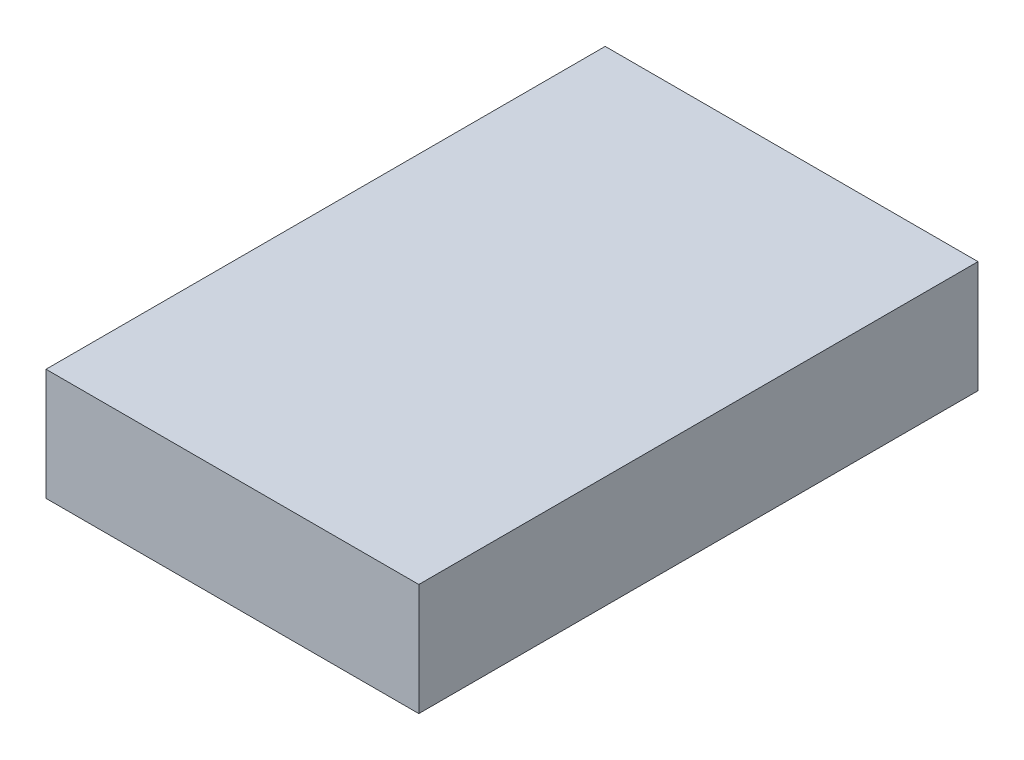
ISO-10303-21;
HEADER;
FILE_DESCRIPTION(('STEP AP214'),'2;1');
FILE_NAME('part.step','',(''),(''),'','','');
FILE_SCHEMA(('AUTOMOTIVE_DESIGN { 1 0 10303 214 1 1 1 1 }'));
ENDSEC;
DATA;
#1=APPLICATION_CONTEXT('core data for automotive mechanical design processes');
#2=APPLICATION_PROTOCOL_DEFINITION('international standard','automotive_design',2000,#1);
#3=PRODUCT_CONTEXT('',#1,'mechanical');
#4=PRODUCT('Part','Part','',(#3));
#5=PRODUCT_RELATED_PRODUCT_CATEGORY('part','',(#4));
#6=PRODUCT_DEFINITION_FORMATION('','',#4);
#7=PRODUCT_DEFINITION_CONTEXT('part definition',#1,'design');
#8=PRODUCT_DEFINITION('design','',#6,#7);
#9=PRODUCT_DEFINITION_SHAPE('','',#8);
#10=(LENGTH_UNIT() NAMED_UNIT(*) SI_UNIT(.MILLI.,.METRE.));
#11=(NAMED_UNIT(*) PLANE_ANGLE_UNIT() SI_UNIT($,.RADIAN.));
#12=(NAMED_UNIT(*) SI_UNIT($,.STERADIAN.) SOLID_ANGLE_UNIT());
#13=UNCERTAINTY_MEASURE_WITH_UNIT(LENGTH_MEASURE(1.E-05),#10,'distance_accuracy_value','');
#14=(GEOMETRIC_REPRESENTATION_CONTEXT(3) GLOBAL_UNCERTAINTY_ASSIGNED_CONTEXT((#13)) GLOBAL_UNIT_ASSIGNED_CONTEXT((#10,
#11,#12)) REPRESENTATION_CONTEXT('',''));
#15=CARTESIAN_POINT('',(0.,0.,0.));
#16=DIRECTION('',(0.,0.,1.));
#17=DIRECTION('',(1.,0.,0.));
#18=AXIS2_PLACEMENT_3D('',#15,#16,#17);
#19=CARTESIAN_POINT('',(10.,3.,15.));
#20=DIRECTION('',(-1.,0.,0.));
#21=DIRECTION('',(0.,-1.,0.));
#22=AXIS2_PLACEMENT_3D('',#19,#20,#21);
#23=PLANE('',#22);
#24=DIRECTION('',(0.,1.,0.));
#25=VECTOR('',#24,1.);
#26=CARTESIAN_POINT('',(10.,3.,-15.));
#27=LINE('',#26,#25);
#28=CARTESIAN_POINT('',(10.,-3.,-15.));
#29=VERTEX_POINT('',#28);
#30=CARTESIAN_POINT('',(10.,3.,-15.));
#31=VERTEX_POINT('',#30);
#32=EDGE_CURVE('E105',#29,#31,#27,.T.);
#33=ORIENTED_EDGE('',*,*,#32,.T.);
#34=DIRECTION('',(0.,0.,-1.));
#35=VECTOR('',#34,1.);
#36=CARTESIAN_POINT('',(10.,3.,15.));
#37=LINE('',#36,#35);
#38=CARTESIAN_POINT('',(10.,3.,15.));
#39=VERTEX_POINT('',#38);
#40=EDGE_CURVE('E11',#39,#31,#37,.T.);
#41=ORIENTED_EDGE('',*,*,#40,.F.);
#42=DIRECTION('',(0.,1.,0.));
#43=VECTOR('',#42,1.);
#44=CARTESIAN_POINT('',(10.,3.,15.));
#45=LINE('',#44,#43);
#46=CARTESIAN_POINT('',(10.,-3.,15.));
#47=VERTEX_POINT('',#46);
#48=EDGE_CURVE('E89',#47,#39,#45,.T.);
#49=ORIENTED_EDGE('',*,*,#48,.F.);
#50=DIRECTION('',(0.,0.,-1.));
#51=VECTOR('',#50,1.);
#52=CARTESIAN_POINT('',(10.,-3.,15.));
#53=LINE('',#52,#51);
#54=EDGE_CURVE('E98',#47,#29,#53,.T.);
#55=ORIENTED_EDGE('',*,*,#54,.T.);
#56=EDGE_LOOP('',(#33,#41,#49,#55));
#57=FACE_BOUND('',#56,.T.);
#58=ADVANCED_FACE('F39',(#57),#23,.F.);
#59=CARTESIAN_POINT('',(-10.,3.,15.));
#60=DIRECTION('',(0.,-1.,0.));
#61=DIRECTION('',(0.,0.,-1.));
#62=AXIS2_PLACEMENT_3D('',#59,#60,#61);
#63=PLANE('',#62);
#64=DIRECTION('',(-1.,0.,0.));
#65=VECTOR('',#64,1.);
#66=CARTESIAN_POINT('',(-10.,3.,-15.));
#67=LINE('',#66,#65);
#68=CARTESIAN_POINT('',(-10.,3.,-15.));
#69=VERTEX_POINT('',#68);
#70=EDGE_CURVE('E94',#31,#69,#67,.T.);
#71=ORIENTED_EDGE('',*,*,#70,.T.);
#72=DIRECTION('',(0.,0.,-1.));
#73=VECTOR('',#72,1.);
#74=CARTESIAN_POINT('',(-10.,3.,15.));
#75=LINE('',#74,#73);
#76=CARTESIAN_POINT('',(-10.,3.,15.));
#77=VERTEX_POINT('',#76);
#78=EDGE_CURVE('E50',#77,#69,#75,.T.);
#79=ORIENTED_EDGE('',*,*,#78,.F.);
#80=DIRECTION('',(-1.,0.,0.));
#81=VECTOR('',#80,1.);
#82=CARTESIAN_POINT('',(-10.,3.,15.));
#83=LINE('',#82,#81);
#84=EDGE_CURVE('E83',#39,#77,#83,.T.);
#85=ORIENTED_EDGE('',*,*,#84,.F.);
#86=ORIENTED_EDGE('',*,*,#40,.T.);
#87=EDGE_LOOP('',(#71,#79,#85,#86));
#88=FACE_BOUND('',#87,.T.);
#89=ADVANCED_FACE('F91',(#88),#63,.F.);
#90=CARTESIAN_POINT('',(-10.,3.,15.));
#91=DIRECTION('',(1.,0.,0.));
#92=DIRECTION('',(0.,0.,-1.));
#93=AXIS2_PLACEMENT_3D('',#90,#91,#92);
#94=PLANE('',#93);
#95=DIRECTION('',(0.,-1.,0.));
#96=VECTOR('',#95,1.);
#97=CARTESIAN_POINT('',(-10.,3.,-15.));
#98=LINE('',#97,#96);
#99=CARTESIAN_POINT('',(-10.,-3.,-15.));
#100=VERTEX_POINT('',#99);
#101=EDGE_CURVE('E75',#69,#100,#98,.T.);
#102=ORIENTED_EDGE('',*,*,#101,.T.);
#103=DIRECTION('',(0.,0.,-1.));
#104=VECTOR('',#103,1.);
#105=CARTESIAN_POINT('',(-10.,-3.,15.));
#106=LINE('',#105,#104);
#107=CARTESIAN_POINT('',(-10.,-3.,15.));
#108=VERTEX_POINT('',#107);
#109=EDGE_CURVE('E92',#108,#100,#106,.T.);
#110=ORIENTED_EDGE('',*,*,#109,.F.);
#111=DIRECTION('',(0.,-1.,0.));
#112=VECTOR('',#111,1.);
#113=CARTESIAN_POINT('',(-10.,3.,15.));
#114=LINE('',#113,#112);
#115=EDGE_CURVE('E86',#77,#108,#114,.T.);
#116=ORIENTED_EDGE('',*,*,#115,.F.);
#117=ORIENTED_EDGE('',*,*,#78,.T.);
#118=EDGE_LOOP('',(#102,#110,#116,#117));
#119=FACE_BOUND('',#118,.T.);
#120=ADVANCED_FACE('F96',(#119),#94,.F.);
#121=CARTESIAN_POINT('',(-10.,-3.,15.));
#122=DIRECTION('',(0.,1.,0.));
#123=DIRECTION('',(0.,0.,1.));
#124=AXIS2_PLACEMENT_3D('',#121,#122,#123);
#125=PLANE('',#124);
#126=DIRECTION('',(1.,0.,0.));
#127=VECTOR('',#126,1.);
#128=CARTESIAN_POINT('',(-10.,-3.,-15.));
#129=LINE('',#128,#127);
#130=EDGE_CURVE('E79',#100,#29,#129,.T.);
#131=ORIENTED_EDGE('',*,*,#130,.T.);
#132=ORIENTED_EDGE('',*,*,#54,.F.);
#133=DIRECTION('',(1.,0.,0.));
#134=VECTOR('',#133,1.);
#135=CARTESIAN_POINT('',(-10.,-3.,15.));
#136=LINE('',#135,#134);
#137=EDGE_CURVE('E54',#108,#47,#136,.T.);
#138=ORIENTED_EDGE('',*,*,#137,.F.);
#139=ORIENTED_EDGE('',*,*,#109,.T.);
#140=EDGE_LOOP('',(#131,#132,#138,#139));
#141=FACE_BOUND('',#140,.T.);
#142=ADVANCED_FACE('F108',(#141),#125,.F.);
#143=CARTESIAN_POINT('',(0.,0.,15.));
#144=DIRECTION('',(0.,0.,1.));
#145=DIRECTION('',(1.,0.,0.));
#146=AXIS2_PLACEMENT_3D('',#143,#144,#145);
#147=PLANE('',#146);
#148=ORIENTED_EDGE('',*,*,#48,.T.);
#149=ORIENTED_EDGE('',*,*,#84,.T.);
#150=ORIENTED_EDGE('',*,*,#115,.T.);
#151=ORIENTED_EDGE('',*,*,#137,.T.);
#152=EDGE_LOOP('',(#148,#149,#150,#151));
#153=FACE_BOUND('',#152,.T.);
#154=ADVANCED_FACE('F88',(#153),#147,.T.);
#155=CARTESIAN_POINT('',(0.,0.,-15.));
#156=DIRECTION('',(0.,0.,1.));
#157=DIRECTION('',(1.,0.,0.));
#158=AXIS2_PLACEMENT_3D('',#155,#156,#157);
#159=PLANE('',#158);
#160=ORIENTED_EDGE('',*,*,#32,.F.);
#161=ORIENTED_EDGE('',*,*,#130,.F.);
#162=ORIENTED_EDGE('',*,*,#101,.F.);
#163=ORIENTED_EDGE('',*,*,#70,.F.);
#164=EDGE_LOOP('',(#160,#161,#162,#163));
#165=FACE_BOUND('',#164,.T.);
#166=ADVANCED_FACE('F115',(#165),#159,.F.);
#167=CLOSED_SHELL('',(#58,#89,#120,#142,#154,#166));
#168=MANIFOLD_SOLID_BREP('B2',#167);
#169=ADVANCED_BREP_SHAPE_REPRESENTATION('',(#18,#168),#14);
#170=SHAPE_DEFINITION_REPRESENTATION(#9,#169);
ENDSEC;
END-ISO-10303-21;
